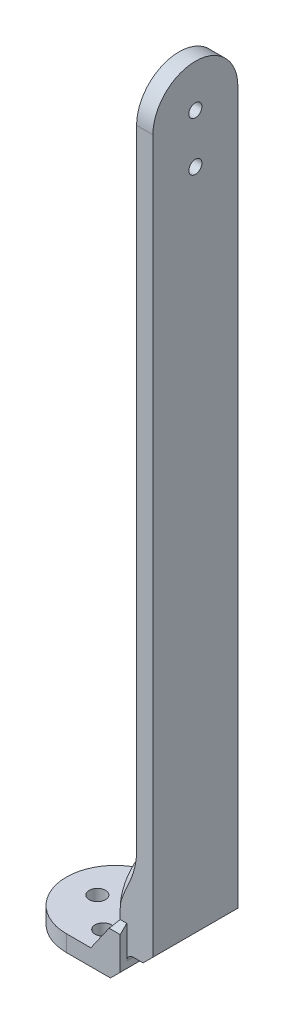
ISO-10303-21;
HEADER;
FILE_DESCRIPTION(('STEP AP214'),'2;1');
FILE_NAME('part.step','',(''),(''),'','','');
FILE_SCHEMA(('AUTOMOTIVE_DESIGN { 1 0 10303 214 1 1 1 1 }'));
ENDSEC;
DATA;
#1=APPLICATION_CONTEXT('core data for automotive mechanical design processes');
#2=APPLICATION_PROTOCOL_DEFINITION('international standard','automotive_design',2000,#1);
#3=PRODUCT_CONTEXT('',#1,'mechanical');
#4=PRODUCT('Part','Part','',(#3));
#5=PRODUCT_RELATED_PRODUCT_CATEGORY('part','',(#4));
#6=PRODUCT_DEFINITION_FORMATION('','',#4);
#7=PRODUCT_DEFINITION_CONTEXT('part definition',#1,'design');
#8=PRODUCT_DEFINITION('design','',#6,#7);
#9=PRODUCT_DEFINITION_SHAPE('','',#8);
#10=(LENGTH_UNIT() NAMED_UNIT(*) SI_UNIT(.MILLI.,.METRE.));
#11=(NAMED_UNIT(*) PLANE_ANGLE_UNIT() SI_UNIT($,.RADIAN.));
#12=(NAMED_UNIT(*) SI_UNIT($,.STERADIAN.) SOLID_ANGLE_UNIT());
#13=UNCERTAINTY_MEASURE_WITH_UNIT(LENGTH_MEASURE(1.E-05),#10,'distance_accuracy_value','');
#14=(GEOMETRIC_REPRESENTATION_CONTEXT(3) GLOBAL_UNCERTAINTY_ASSIGNED_CONTEXT((#13)) GLOBAL_UNIT_ASSIGNED_CONTEXT((#10,
#11,#12)) REPRESENTATION_CONTEXT('',''));
#15=CARTESIAN_POINT('',(0.,0.,0.));
#16=DIRECTION('',(0.,0.,1.));
#17=DIRECTION('',(1.,0.,0.));
#18=AXIS2_PLACEMENT_3D('',#15,#16,#17);
#19=CARTESIAN_POINT('',(-34.25,0.,0.));
#20=DIRECTION('',(1.,0.,0.));
#21=DIRECTION('',(0.,0.,-1.));
#22=AXIS2_PLACEMENT_3D('',#19,#20,#21);
#23=PLANE('',#22);
#24=DIRECTION('',(0.,-1.,0.));
#25=VECTOR('',#24,1.);
#26=CARTESIAN_POINT('',(-34.25,0.,11.));
#27=LINE('',#26,#25);
#28=CARTESIAN_POINT('',(-34.25,-6.,11.));
#29=VERTEX_POINT('',#28);
#30=CARTESIAN_POINT('',(-34.25,-8.,11.));
#31=VERTEX_POINT('',#30);
#32=EDGE_CURVE('E519',#29,#31,#27,.T.);
#33=ORIENTED_EDGE('',*,*,#32,.F.);
#34=DIRECTION('',(0.,0.,-1.));
#35=VECTOR('',#34,1.);
#36=CARTESIAN_POINT('',(-34.25,-6.,-13.));
#37=LINE('',#36,#35);
#38=CARTESIAN_POINT('',(-34.25,-6.,-11.));
#39=VERTEX_POINT('',#38);
#40=EDGE_CURVE('E531',#29,#39,#37,.T.);
#41=ORIENTED_EDGE('',*,*,#40,.T.);
#42=DIRECTION('',(0.,1.,0.));
#43=VECTOR('',#42,1.);
#44=CARTESIAN_POINT('',(-34.25,0.,-11.));
#45=LINE('',#44,#43);
#46=CARTESIAN_POINT('',(-34.25,-8.,-11.));
#47=VERTEX_POINT('',#46);
#48=EDGE_CURVE('E502',#47,#39,#45,.T.);
#49=ORIENTED_EDGE('',*,*,#48,.F.);
#50=DIRECTION('',(0.,0.,1.));
#51=VECTOR('',#50,1.);
#52=CARTESIAN_POINT('',(-34.25,-8.,0.));
#53=LINE('',#52,#51);
#54=EDGE_CURVE('E460',#47,#31,#53,.T.);
#55=ORIENTED_EDGE('',*,*,#54,.T.);
#56=EDGE_LOOP('',(#33,#41,#49,#55));
#57=FACE_BOUND('',#56,.T.);
#58=ADVANCED_FACE('F44',(#57),#23,.F.);
#59=CARTESIAN_POINT('',(-34.25,-6.,-13.));
#60=DIRECTION('',(0.,-1.,0.));
#61=DIRECTION('',(0.,0.,-1.));
#62=AXIS2_PLACEMENT_3D('',#59,#60,#61);
#63=PLANE('',#62);
#64=DIRECTION('',(-1.,0.,0.));
#65=VECTOR('',#64,1.);
#66=CARTESIAN_POINT('',(-34.25,-6.,11.));
#67=LINE('',#66,#65);
#68=CARTESIAN_POINT('',(-30.25,-6.,11.));
#69=VERTEX_POINT('',#68);
#70=EDGE_CURVE('E580',#69,#29,#67,.T.);
#71=ORIENTED_EDGE('',*,*,#70,.F.);
#72=DIRECTION('',(0.,0.,-1.));
#73=VECTOR('',#72,1.);
#74=CARTESIAN_POINT('',(-30.25,-6.,-13.));
#75=LINE('',#74,#73);
#76=CARTESIAN_POINT('',(-30.25,-6.,-11.));
#77=VERTEX_POINT('',#76);
#78=EDGE_CURVE('E535',#69,#77,#75,.T.);
#79=ORIENTED_EDGE('',*,*,#78,.T.);
#80=DIRECTION('',(1.,0.,0.));
#81=VECTOR('',#80,1.);
#82=CARTESIAN_POINT('',(-34.25,-6.,-11.));
#83=LINE('',#82,#81);
#84=EDGE_CURVE('E454',#39,#77,#83,.T.);
#85=ORIENTED_EDGE('',*,*,#84,.F.);
#86=ORIENTED_EDGE('',*,*,#40,.F.);
#87=EDGE_LOOP('',(#71,#79,#85,#86));
#88=FACE_BOUND('',#87,.T.);
#89=ADVANCED_FACE('F343',(#88),#63,.F.);
#90=CARTESIAN_POINT('',(0.,-8.,0.));
#91=DIRECTION('',(0.,-1.,0.));
#92=DIRECTION('',(0.,0.,-1.));
#93=AXIS2_PLACEMENT_3D('',#90,#91,#92);
#94=PLANE('',#93);
#95=CARTESIAN_POINT('',(-40.203234351295,-8.,-8.25));
#96=DIRECTION('',(0.,1.,0.));
#97=DIRECTION('',(0.,0.,1.));
#98=AXIS2_PLACEMENT_3D('',#95,#96,#97);
#99=CIRCLE('',#98,2.5);
#100=CARTESIAN_POINT('',(-40.203234351295,-8.,-5.75));
#101=VERTEX_POINT('',#100);
#102=EDGE_CURVE('E545',#101,#101,#99,.T.);
#103=ORIENTED_EDGE('',*,*,#102,.F.);
#104=EDGE_LOOP('',(#103));
#105=FACE_BOUND('',#104,.T.);
#106=CARTESIAN_POINT('',(-50.25,-8.,0.));
#107=DIRECTION('',(0.,1.,0.));
#108=DIRECTION('',(0.,0.,1.));
#109=AXIS2_PLACEMENT_3D('',#106,#107,#108);
#110=CIRCLE('',#109,2.5);
#111=CARTESIAN_POINT('',(-50.25,-8.,2.5));
#112=VERTEX_POINT('',#111);
#113=EDGE_CURVE('E544',#112,#112,#110,.T.);
#114=ORIENTED_EDGE('',*,*,#113,.F.);
#115=EDGE_LOOP('',(#114));
#116=FACE_BOUND('',#115,.T.);
#117=CARTESIAN_POINT('',(-40.203234351295,-8.,8.25));
#118=DIRECTION('',(0.,1.,0.));
#119=DIRECTION('',(0.,0.,-1.));
#120=AXIS2_PLACEMENT_3D('',#117,#118,#119);
#121=CIRCLE('',#120,2.5);
#122=CARTESIAN_POINT('',(-40.203234351295,-8.,5.75));
#123=VERTEX_POINT('',#122);
#124=EDGE_CURVE('E553',#123,#123,#121,.T.);
#125=ORIENTED_EDGE('',*,*,#124,.F.);
#126=EDGE_LOOP('',(#125));
#127=FACE_BOUND('',#126,.T.);
#128=DIRECTION('',(0.,0.,1.));
#129=VECTOR('',#128,1.);
#130=CARTESIAN_POINT('',(-37.25,-8.,11.));
#131=LINE('',#130,#129);
#132=CARTESIAN_POINT('',(-37.25,-8.,11.));
#133=VERTEX_POINT('',#132);
#134=CARTESIAN_POINT('',(-37.25,-8.,15.));
#135=VERTEX_POINT('',#134);
#136=EDGE_CURVE('E201',#133,#135,#131,.T.);
#137=ORIENTED_EDGE('',*,*,#136,.F.);
#138=DIRECTION('',(-1.,0.,0.));
#139=VECTOR('',#138,1.);
#140=CARTESIAN_POINT('',(-37.25,-8.,11.));
#141=LINE('',#140,#139);
#142=EDGE_CURVE('E575',#31,#133,#141,.T.);
#143=ORIENTED_EDGE('',*,*,#142,.F.);
#144=ORIENTED_EDGE('',*,*,#54,.F.);
#145=DIRECTION('',(-1.,0.,0.));
#146=VECTOR('',#145,1.);
#147=CARTESIAN_POINT('',(-37.25,-8.,-11.));
#148=LINE('',#147,#146);
#149=CARTESIAN_POINT('',(-37.25,-8.,-11.));
#150=VERTEX_POINT('',#149);
#151=EDGE_CURVE('E511',#47,#150,#148,.T.);
#152=ORIENTED_EDGE('',*,*,#151,.T.);
#153=DIRECTION('',(0.,0.,-1.));
#154=VECTOR('',#153,1.);
#155=CARTESIAN_POINT('',(-37.25,-8.,-11.));
#156=LINE('',#155,#154);
#157=CARTESIAN_POINT('',(-37.25,-8.,-15.));
#158=VERTEX_POINT('',#157);
#159=EDGE_CURVE('E504',#150,#158,#156,.T.);
#160=ORIENTED_EDGE('',*,*,#159,.T.);
#161=DIRECTION('',(1.,0.,0.));
#162=VECTOR('',#161,1.);
#163=CARTESIAN_POINT('',(-59.75,-8.,-15.));
#164=LINE('',#163,#162);
#165=CARTESIAN_POINT('',(-44.75,-8.,-15.));
#166=VERTEX_POINT('',#165);
#167=EDGE_CURVE('E227',#166,#158,#164,.T.);
#168=ORIENTED_EDGE('',*,*,#167,.F.);
#169=CARTESIAN_POINT('',(-44.75,-8.,0.));
#170=DIRECTION('',(0.,-1.,0.));
#171=DIRECTION('',(0.,0.,-1.));
#172=AXIS2_PLACEMENT_3D('',#169,#170,#171);
#173=CIRCLE('',#172,15.);
#174=CARTESIAN_POINT('',(-59.75,-8.,0.));
#175=VERTEX_POINT('',#174);
#176=EDGE_CURVE('E485',#166,#175,#173,.F.);
#177=ORIENTED_EDGE('',*,*,#176,.T.);
#178=CARTESIAN_POINT('',(-44.75,-8.,0.));
#179=DIRECTION('',(0.,-1.,0.));
#180=DIRECTION('',(0.,0.,-1.));
#181=AXIS2_PLACEMENT_3D('',#178,#179,#180);
#182=CIRCLE('',#181,15.);
#183=CARTESIAN_POINT('',(-44.75,-8.,15.));
#184=VERTEX_POINT('',#183);
#185=EDGE_CURVE('E225',#175,#184,#182,.F.);
#186=ORIENTED_EDGE('',*,*,#185,.T.);
#187=DIRECTION('',(-1.,0.,0.));
#188=VECTOR('',#187,1.);
#189=CARTESIAN_POINT('',(-59.75,-8.,15.));
#190=LINE('',#189,#188);
#191=EDGE_CURVE('E217',#135,#184,#190,.T.);
#192=ORIENTED_EDGE('',*,*,#191,.F.);
#193=EDGE_LOOP('',(#137,#143,#144,#152,#160,#168,#177,#186,#192));
#194=FACE_BOUND('',#193,.T.);
#195=ADVANCED_FACE('F224',(#105,#116,#127,#194),#94,.F.);
#196=CARTESIAN_POINT('',(-30.25,5.,0.));
#197=DIRECTION('',(-1.,0.,0.));
#198=DIRECTION('',(0.,0.,1.));
#199=AXIS2_PLACEMENT_3D('',#196,#197,#198);
#200=PLANE('',#199);
#201=CARTESIAN_POINT('',(-30.25,5.,0.));
#202=DIRECTION('',(-1.,0.,0.));
#203=DIRECTION('',(0.,0.,1.));
#204=AXIS2_PLACEMENT_3D('',#201,#202,#203);
#205=CIRCLE('',#204,10.);
#206=CARTESIAN_POINT('',(-30.25,5.,10.));
#207=VERTEX_POINT('',#206);
#208=EDGE_CURVE('E280',#207,#207,#205,.T.);
#209=ORIENTED_EDGE('',*,*,#208,.F.);
#210=EDGE_LOOP('',(#209));
#211=FACE_BOUND('',#210,.T.);
#212=DIRECTION('',(0.,1.,0.));
#213=VECTOR('',#212,1.);
#214=CARTESIAN_POINT('',(-30.25,5.,11.));
#215=LINE('',#214,#213);
#216=CARTESIAN_POINT('',(-30.25,2.,11.));
#217=VERTEX_POINT('',#216);
#218=EDGE_CURVE('E213',#69,#217,#215,.T.);
#219=ORIENTED_EDGE('',*,*,#218,.T.);
#220=DIRECTION('',(0.,0.,1.));
#221=VECTOR('',#220,1.);
#222=CARTESIAN_POINT('',(-30.25,2.,11.));
#223=LINE('',#222,#221);
#224=CARTESIAN_POINT('',(-30.25,2.,13.));
#225=VERTEX_POINT('',#224);
#226=EDGE_CURVE('E215',#217,#225,#223,.T.);
#227=ORIENTED_EDGE('',*,*,#226,.T.);
#228=DIRECTION('',(0.,-1.,0.));
#229=VECTOR('',#228,1.);
#230=CARTESIAN_POINT('',(-30.25,228.001,13.));
#231=LINE('',#230,#229);
#232=CARTESIAN_POINT('',(-30.25,5.,13.));
#233=VERTEX_POINT('',#232);
#234=EDGE_CURVE('E226',#233,#225,#231,.T.);
#235=ORIENTED_EDGE('',*,*,#234,.F.);
#236=CARTESIAN_POINT('',(-30.25,5.,0.));
#237=DIRECTION('',(-1.,0.,0.));
#238=DIRECTION('',(0.,0.,1.));
#239=AXIS2_PLACEMENT_3D('',#236,#237,#238);
#240=CIRCLE('',#239,13.);
#241=CARTESIAN_POINT('',(-30.25,5.,-13.));
#242=VERTEX_POINT('',#241);
#243=EDGE_CURVE('E277',#233,#242,#240,.T.);
#244=ORIENTED_EDGE('',*,*,#243,.T.);
#245=DIRECTION('',(0.,-1.,0.));
#246=VECTOR('',#245,1.);
#247=CARTESIAN_POINT('',(-30.25,228.001,-13.));
#248=LINE('',#247,#246);
#249=CARTESIAN_POINT('',(-30.25,2.,-13.));
#250=VERTEX_POINT('',#249);
#251=EDGE_CURVE('E239',#242,#250,#248,.T.);
#252=ORIENTED_EDGE('',*,*,#251,.T.);
#253=DIRECTION('',(0.,0.,-1.));
#254=VECTOR('',#253,1.);
#255=CARTESIAN_POINT('',(-30.25,2.,-11.));
#256=LINE('',#255,#254);
#257=CARTESIAN_POINT('',(-30.25,2.,-11.));
#258=VERTEX_POINT('',#257);
#259=EDGE_CURVE('E494',#258,#250,#256,.T.);
#260=ORIENTED_EDGE('',*,*,#259,.F.);
#261=DIRECTION('',(0.,-1.,0.));
#262=VECTOR('',#261,1.);
#263=CARTESIAN_POINT('',(-30.25,5.,-11.));
#264=LINE('',#263,#262);
#265=EDGE_CURVE('E527',#258,#77,#264,.T.);
#266=ORIENTED_EDGE('',*,*,#265,.T.);
#267=ORIENTED_EDGE('',*,*,#78,.F.);
#268=EDGE_LOOP('',(#219,#227,#235,#244,#252,#260,#266,#267));
#269=FACE_BOUND('',#268,.T.);
#270=ADVANCED_FACE('F312',(#211,#269),#200,.T.);
#271=CARTESIAN_POINT('',(-25.25,215.,13.));
#272=DIRECTION('',(0.,0.,1.));
#273=DIRECTION('',(1.,0.,0.));
#274=AXIS2_PLACEMENT_3D('',#271,#272,#273);
#275=PLANE('',#274);
#276=DIRECTION('',(-1.,0.,0.));
#277=VECTOR('',#276,1.);
#278=CARTESIAN_POINT('',(-25.25,-6.00000000000001,13.));
#279=LINE('',#278,#277);
#280=CARTESIAN_POINT('',(-23.25,-6.00000000000001,13.));
#281=VERTEX_POINT('',#280);
#282=CARTESIAN_POINT('',(-26.25,-6.00000000000001,13.));
#283=VERTEX_POINT('',#282);
#284=EDGE_CURVE('E480',#281,#283,#279,.T.);
#285=ORIENTED_EDGE('',*,*,#284,.F.);
#286=DIRECTION('',(-0.707106781186548,-0.707106781186548,0.));
#287=VECTOR('',#286,1.);
#288=CARTESIAN_POINT('',(86.25,103.5,13.));
#289=LINE('',#288,#287);
#290=CARTESIAN_POINT('',(-20.25,-2.99999999999998,13.));
#291=VERTEX_POINT('',#290);
#292=EDGE_CURVE('E11',#281,#291,#289,.F.);
#293=ORIENTED_EDGE('',*,*,#292,.T.);
#294=DIRECTION('',(0.,-1.,0.));
#295=VECTOR('',#294,1.);
#296=CARTESIAN_POINT('',(-20.25,215.,13.));
#297=LINE('',#296,#295);
#298=CARTESIAN_POINT('',(-20.25,215.,13.));
#299=VERTEX_POINT('',#298);
#300=EDGE_CURVE('E259',#299,#291,#297,.T.);
#301=ORIENTED_EDGE('',*,*,#300,.F.);
#302=DIRECTION('',(1.,0.,0.));
#303=VECTOR('',#302,1.);
#304=CARTESIAN_POINT('',(-25.25,215.,13.));
#305=LINE('',#304,#303);
#306=CARTESIAN_POINT('',(-25.25,215.,13.));
#307=VERTEX_POINT('',#306);
#308=EDGE_CURVE('E275',#307,#299,#305,.T.);
#309=ORIENTED_EDGE('',*,*,#308,.F.);
#310=DIRECTION('',(0.,-1.,0.));
#311=VECTOR('',#310,1.);
#312=CARTESIAN_POINT('',(-25.25,215.,13.));
#313=LINE('',#312,#311);
#314=CARTESIAN_POINT('',(-25.25,22.3253168797559,13.));
#315=VERTEX_POINT('',#314);
#316=EDGE_CURVE('E265',#307,#315,#313,.T.);
#317=ORIENTED_EDGE('',*,*,#316,.T.);
#318=CARTESIAN_POINT('',(-25.25,22.3253168797559,13.));
#319=CARTESIAN_POINT('',(-25.2499980847217,22.0617570442487,13.));
#320=CARTESIAN_POINT('',(-25.2566666611371,21.7982596926096,13.));
#321=CARTESIAN_POINT('',(-25.2826483802802,21.2719699810068,13.));
#322=CARTESIAN_POINT('',(-25.3019573957985,21.0091774190351,13.));
#323=CARTESIAN_POINT('',(-25.3777603615151,20.2229625738944,13.));
#324=CARTESIAN_POINT('',(-25.4521328636717,19.7012046205128,13.));
#325=CARTESIAN_POINT('',(-25.6420718027335,18.6683724712777,13.));
#326=CARTESIAN_POINT('',(-25.7574128892152,18.1572557094616,13.));
#327=CARTESIAN_POINT('',(-25.9566660455814,17.3976979507014,13.));
#328=CARTESIAN_POINT('',(-26.0274510462779,17.1457169327012,13.));
#329=CARTESIAN_POINT('',(-26.1769784992198,16.6441080927741,13.));
#330=CARTESIAN_POINT('',(-26.2557214290855,16.3944804130746,13.));
#331=CARTESIAN_POINT('',(-26.4916544931231,15.6823684677556,13.));
#332=CARTESIAN_POINT('',(-26.6577112352495,15.2228167677706,13.));
#333=CARTESIAN_POINT('',(-27.0090206069845,14.3112607358203,13.));
#334=CARTESIAN_POINT('',(-27.1942721459856,13.8592559767463,13.));
#335=CARTESIAN_POINT('',(-27.4817512102848,13.1854225115711,13.));
#336=CARTESIAN_POINT('',(-27.5791743211592,12.9615146428972,13.));
#337=CARTESIAN_POINT('',(-27.7763037174669,12.5147043395036,13.));
#338=CARTESIAN_POINT('',(-27.8760100185408,12.2918019116841,13.));
#339=CARTESIAN_POINT('',(-28.0767941026496,11.8463246330699,13.));
#340=CARTESIAN_POINT('',(-28.1778732715444,11.6237504108137,13.));
#341=CARTESIAN_POINT('',(-28.3801104057352,11.1786325941297,13.));
#342=CARTESIAN_POINT('',(-28.4812683725014,10.956089000369,13.));
#343=CARTESIAN_POINT('',(-28.6842394025931,10.5060025611996,13.));
#344=CARTESIAN_POINT('',(-28.7860260104624,10.2784477135303,13.));
#345=CARTESIAN_POINT('',(-28.9864025513293,9.82193771836916,13.));
#346=CARTESIAN_POINT('',(-29.08499264882,9.59298264365622,13.));
#347=CARTESIAN_POINT('',(-29.2763955901504,9.13359629544239,13.));
#348=CARTESIAN_POINT('',(-29.3692275882597,8.90317307926783,13.));
#349=CARTESIAN_POINT('',(-29.5467334673255,8.43909492273007,13.));
#350=CARTESIAN_POINT('',(-29.6314052318566,8.20543916185193,13.));
#351=CARTESIAN_POINT('',(-29.7899076681996,7.73186893042751,13.));
#352=CARTESIAN_POINT('',(-29.8636236790118,7.49191552648383,13.));
#353=CARTESIAN_POINT('',(-29.9949869599887,7.00775849547569,13.));
#354=CARTESIAN_POINT('',(-30.052649391667,6.7635591116737,13.));
#355=CARTESIAN_POINT('',(-30.1242254682383,6.39268664135692,13.));
#356=CARTESIAN_POINT('',(-30.1456892746253,6.26745552582972,13.));
#357=CARTESIAN_POINT('',(-30.1829146062684,6.01614822452363,13.));
#358=CARTESIAN_POINT('',(-30.1986765969525,5.89007210857655,13.));
#359=CARTESIAN_POINT('',(-30.224129428176,5.63685235777511,13.));
#360=CARTESIAN_POINT('',(-30.2337985600472,5.50970652329528,13.));
#361=CARTESIAN_POINT('',(-30.2467505281899,5.25504421898492,13.));
#362=CARTESIAN_POINT('',(-30.2500309807929,5.12752762858693,13.));
#363=CARTESIAN_POINT('',(-30.25,5.,13.));
#364=B_SPLINE_CURVE_WITH_KNOTS('',3,(#318,#319,#320,#321,#322,#323,#324,#325,#326,#327,#328,
#329,#330,#331,#332,#333,#334,#335,#336,#337,#338,#339,#340,#341,#342,#343,#344,#345,#346,#347,
#348,#349,#350,#351,#352,#353,#354,#355,#356,#357,#358,#359,#360,#361,#362,#363),.UNSPECIFIED.,
.F.,.F.,(4,2,2,2,2,2,2,2,2,2,2,2,2,2,2,2,2,2,2,2,2,2,4),(0.,0.790489495569374,1.58072101833403,
3.15969446602514,4.73011384383495,5.51520553026805,6.30034436449006,7.7656158006406,
9.23080402879242,9.96334745837972,10.695895907618,11.429248808871,12.1626157371087,
12.9104525346885,13.6582507871594,14.4034109180194,15.1487637952592,15.9014382055543,
16.653399335843,17.0344605713666,17.415490694588,17.7978708522317,18.1803936517354),.UNSPECIFIED.);
#365=EDGE_CURVE('E287',#315,#233,#364,.T.);
#366=ORIENTED_EDGE('',*,*,#365,.T.);
#367=ORIENTED_EDGE('',*,*,#234,.T.);
#368=DIRECTION('',(1.,0.,0.));
#369=VECTOR('',#368,1.);
#370=CARTESIAN_POINT('',(-25.25,2.,13.));
#371=LINE('',#370,#369);
#372=CARTESIAN_POINT('',(-28.25,2.,13.));
#373=VERTEX_POINT('',#372);
#374=EDGE_CURVE('E446',#225,#373,#371,.T.);
#375=ORIENTED_EDGE('',*,*,#374,.T.);
#376=DIRECTION('',(0.,-1.,0.));
#377=VECTOR('',#376,1.);
#378=CARTESIAN_POINT('',(-28.25,215.,13.));
#379=LINE('',#378,#377);
#380=CARTESIAN_POINT('',(-28.25,-8.,13.));
#381=VERTEX_POINT('',#380);
#382=EDGE_CURVE('E513',#373,#381,#379,.T.);
#383=ORIENTED_EDGE('',*,*,#382,.T.);
#384=CARTESIAN_POINT('',(-26.25,-8.,13.));
#385=DIRECTION('',(0.,0.,1.));
#386=DIRECTION('',(1.,0.,0.));
#387=AXIS2_PLACEMENT_3D('',#384,#385,#386);
#388=CIRCLE('',#387,2.);
#389=EDGE_CURVE('E459',#381,#283,#388,.F.);
#390=ORIENTED_EDGE('',*,*,#389,.T.);
#391=EDGE_LOOP('',(#285,#293,#301,#309,#317,#366,#367,#375,#383,#390));
#392=FACE_BOUND('',#391,.T.);
#393=ADVANCED_FACE('F310',(#392),#275,.T.);
#394=CARTESIAN_POINT('',(-59.75,-13.,-15.));
#395=DIRECTION('',(0.,0.,1.));
#396=DIRECTION('',(1.,0.,0.));
#397=AXIS2_PLACEMENT_3D('',#394,#395,#396);
#398=PLANE('',#397);
#399=DIRECTION('',(0.,1.,0.));
#400=VECTOR('',#399,1.);
#401=CARTESIAN_POINT('',(-28.25,-6.,-15.));
#402=LINE('',#401,#400);
#403=CARTESIAN_POINT('',(-28.25,-9.99999999999997,-15.));
#404=VERTEX_POINT('',#403);
#405=CARTESIAN_POINT('',(-28.25,0.,-15.));
#406=VERTEX_POINT('',#405);
#407=EDGE_CURVE('E515',#404,#406,#402,.T.);
#408=ORIENTED_EDGE('',*,*,#407,.F.);
#409=DIRECTION('',(-0.707106781186546,-0.707106781186549,0.));
#410=VECTOR('',#409,1.);
#411=CARTESIAN_POINT('',(-28.25,-9.99999999999997,-15.));
#412=LINE('',#411,#410);
#413=CARTESIAN_POINT('',(-31.25,-13.,-15.));
#414=VERTEX_POINT('',#413);
#415=EDGE_CURVE('E431',#404,#414,#412,.T.);
#416=ORIENTED_EDGE('',*,*,#415,.T.);
#417=DIRECTION('',(1.,0.,0.));
#418=VECTOR('',#417,1.);
#419=CARTESIAN_POINT('',(-59.75,-13.,-15.));
#420=LINE('',#419,#418);
#421=CARTESIAN_POINT('',(-44.75,-13.,-15.));
#422=VERTEX_POINT('',#421);
#423=EDGE_CURVE('E240',#422,#414,#420,.T.);
#424=ORIENTED_EDGE('',*,*,#423,.F.);
#425=DIRECTION('',(0.,1.,0.));
#426=VECTOR('',#425,1.);
#427=CARTESIAN_POINT('',(-44.75,-13.,-15.));
#428=LINE('',#427,#426);
#429=EDGE_CURVE('E475',#422,#166,#428,.T.);
#430=ORIENTED_EDGE('',*,*,#429,.T.);
#431=ORIENTED_EDGE('',*,*,#167,.T.);
#432=DIRECTION('',(0.573462344363328,0.81923192051904,0.));
#433=VECTOR('',#432,1.);
#434=CARTESIAN_POINT('',(-30.25,2.,-15.));
#435=LINE('',#434,#433);
#436=CARTESIAN_POINT('',(-31.65,0.,-15.));
#437=VERTEX_POINT('',#436);
#438=EDGE_CURVE('E514',#158,#437,#435,.T.);
#439=ORIENTED_EDGE('',*,*,#438,.T.);
#440=DIRECTION('',(1.,0.,0.));
#441=VECTOR('',#440,1.);
#442=CARTESIAN_POINT('',(-28.25,0.,-15.));
#443=LINE('',#442,#441);
#444=EDGE_CURVE('E447',#437,#406,#443,.T.);
#445=ORIENTED_EDGE('',*,*,#444,.T.);
#446=EDGE_LOOP('',(#408,#416,#424,#430,#431,#439,#445));
#447=FACE_BOUND('',#446,.T.);
#448=ADVANCED_FACE('F315',(#447),#398,.F.);
#449=CARTESIAN_POINT('',(-30.25,5.,0.));
#450=DIRECTION('',(1.,0.,0.));
#451=DIRECTION('',(0.,0.,-1.));
#452=AXIS2_PLACEMENT_3D('',#449,#450,#451);
#453=CYLINDRICAL_SURFACE('',#452,10.);
#454=ORIENTED_EDGE('',*,*,#208,.T.);
#455=EDGE_LOOP('',(#454));
#456=FACE_BOUND('',#455,.T.);
#457=CARTESIAN_POINT('',(-25.25,5.,0.));
#458=DIRECTION('',(1.,0.,0.));
#459=DIRECTION('',(0.,0.,-1.));
#460=AXIS2_PLACEMENT_3D('',#457,#458,#459);
#461=CIRCLE('',#460,10.);
#462=CARTESIAN_POINT('',(-25.25,5.,-10.));
#463=VERTEX_POINT('',#462);
#464=EDGE_CURVE('E274',#463,#463,#461,.T.);
#465=ORIENTED_EDGE('',*,*,#464,.T.);
#466=EDGE_LOOP('',(#465));
#467=FACE_BOUND('',#466,.T.);
#468=ADVANCED_FACE('F322',(#456,#467),#453,.F.);
#469=CARTESIAN_POINT('',(-20.25,5.,0.));
#470=DIRECTION('',(-1.,0.,0.));
#471=DIRECTION('',(0.,0.,1.));
#472=AXIS2_PLACEMENT_3D('',#469,#470,#471);
#473=PLANE('',#472);
#474=ORIENTED_EDGE('',*,*,#300,.T.);
#475=DIRECTION('',(0.,0.,-1.));
#476=VECTOR('',#475,1.);
#477=CARTESIAN_POINT('',(-20.25,-2.99999999999997,0.));
#478=LINE('',#477,#476);
#479=CARTESIAN_POINT('',(-20.25,-2.99999999999998,-13.));
#480=VERTEX_POINT('',#479);
#481=EDGE_CURVE('E423',#291,#480,#478,.T.);
#482=ORIENTED_EDGE('',*,*,#481,.T.);
#483=DIRECTION('',(0.,1.,0.));
#484=VECTOR('',#483,1.);
#485=CARTESIAN_POINT('',(-20.25,215.,-13.));
#486=LINE('',#485,#484);
#487=CARTESIAN_POINT('',(-20.25,215.,-13.));
#488=VERTEX_POINT('',#487);
#489=EDGE_CURVE('E254',#480,#488,#486,.T.);
#490=ORIENTED_EDGE('',*,*,#489,.T.);
#491=CARTESIAN_POINT('',(-20.25,215.,0.));
#492=DIRECTION('',(1.,0.,0.));
#493=DIRECTION('',(0.,0.,-1.));
#494=AXIS2_PLACEMENT_3D('',#491,#492,#493);
#495=CIRCLE('',#494,13.);
#496=EDGE_CURVE('E267',#488,#299,#495,.T.);
#497=ORIENTED_EDGE('',*,*,#496,.T.);
#498=EDGE_LOOP('',(#474,#482,#490,#497));
#499=FACE_BOUND('',#498,.T.);
#500=CARTESIAN_POINT('',(-20.25,200.,0.));
#501=DIRECTION('',(1.,0.,0.));
#502=DIRECTION('',(0.,0.,-1.));
#503=AXIS2_PLACEMENT_3D('',#500,#501,#502);
#504=CIRCLE('',#503,2.);
#505=CARTESIAN_POINT('',(-20.25,200.,-2.));
#506=VERTEX_POINT('',#505);
#507=EDGE_CURVE('E250',#506,#506,#504,.T.);
#508=ORIENTED_EDGE('',*,*,#507,.F.);
#509=EDGE_LOOP('',(#508));
#510=FACE_BOUND('',#509,.T.);
#511=CARTESIAN_POINT('',(-20.25,215.,0.));
#512=DIRECTION('',(1.,0.,0.));
#513=DIRECTION('',(0.,0.,-1.));
#514=AXIS2_PLACEMENT_3D('',#511,#512,#513);
#515=CIRCLE('',#514,2.);
#516=CARTESIAN_POINT('',(-20.25,215.,-2.));
#517=VERTEX_POINT('',#516);
#518=EDGE_CURVE('E243',#517,#517,#515,.T.);
#519=ORIENTED_EDGE('',*,*,#518,.F.);
#520=EDGE_LOOP('',(#519));
#521=FACE_BOUND('',#520,.T.);
#522=ADVANCED_FACE('F327',(#499,#510,#521),#473,.F.);
#523=CARTESIAN_POINT('',(-25.25,5.,0.));
#524=DIRECTION('',(1.,0.,0.));
#525=DIRECTION('',(0.,0.,-1.));
#526=AXIS2_PLACEMENT_3D('',#523,#524,#525);
#527=PLANE('',#526);
#528=ORIENTED_EDGE('',*,*,#464,.F.);
#529=EDGE_LOOP('',(#528));
#530=FACE_BOUND('',#529,.T.);
#531=ADVANCED_FACE('F318',(#530),#527,.F.);
#532=CARTESIAN_POINT('',(-25.25,215.,0.));
#533=DIRECTION('',(1.,0.,0.));
#534=DIRECTION('',(0.,0.,-1.));
#535=AXIS2_PLACEMENT_3D('',#532,#533,#534);
#536=CYLINDRICAL_SURFACE('',#535,13.);
#537=ORIENTED_EDGE('',*,*,#496,.F.);
#538=DIRECTION('',(1.,0.,0.));
#539=VECTOR('',#538,1.);
#540=CARTESIAN_POINT('',(-25.25,215.,-13.));
#541=LINE('',#540,#539);
#542=CARTESIAN_POINT('',(-25.25,215.,-13.));
#543=VERTEX_POINT('',#542);
#544=EDGE_CURVE('E264',#543,#488,#541,.T.);
#545=ORIENTED_EDGE('',*,*,#544,.F.);
#546=CARTESIAN_POINT('',(-25.25,215.,0.));
#547=DIRECTION('',(1.,0.,0.));
#548=DIRECTION('',(0.,0.,-1.));
#549=AXIS2_PLACEMENT_3D('',#546,#547,#548);
#550=CIRCLE('',#549,13.);
#551=EDGE_CURVE('E256',#543,#307,#550,.T.);
#552=ORIENTED_EDGE('',*,*,#551,.T.);
#553=ORIENTED_EDGE('',*,*,#308,.T.);
#554=EDGE_LOOP('',(#537,#545,#552,#553));
#555=FACE_BOUND('',#554,.T.);
#556=ADVANCED_FACE('F320',(#555),#536,.T.);
#557=CARTESIAN_POINT('',(-25.25,215.,-13.));
#558=DIRECTION('',(0.,0.,-1.));
#559=DIRECTION('',(0.,1.,0.));
#560=AXIS2_PLACEMENT_3D('',#557,#558,#559);
#561=PLANE('',#560);
#562=ORIENTED_EDGE('',*,*,#489,.F.);
#563=DIRECTION('',(0.707106781186548,0.707106781186548,0.));
#564=VECTOR('',#563,1.);
#565=CARTESIAN_POINT('',(86.25,103.5,-13.));
#566=LINE('',#565,#564);
#567=CARTESIAN_POINT('',(-23.25,-6.00000000000001,-13.));
#568=VERTEX_POINT('',#567);
#569=EDGE_CURVE('E67',#480,#568,#566,.F.);
#570=ORIENTED_EDGE('',*,*,#569,.T.);
#571=DIRECTION('',(1.,0.,0.));
#572=VECTOR('',#571,1.);
#573=CARTESIAN_POINT('',(-25.25,-6.00000000000001,-13.));
#574=LINE('',#573,#572);
#575=CARTESIAN_POINT('',(-26.25,-6.00000000000001,-13.));
#576=VERTEX_POINT('',#575);
#577=EDGE_CURVE('E468',#576,#568,#574,.T.);
#578=ORIENTED_EDGE('',*,*,#577,.F.);
#579=CARTESIAN_POINT('',(-26.25,-8.,-13.));
#580=DIRECTION('',(0.,0.,-1.));
#581=DIRECTION('',(0.,1.,0.));
#582=AXIS2_PLACEMENT_3D('',#579,#580,#581);
#583=CIRCLE('',#582,2.);
#584=CARTESIAN_POINT('',(-28.25,-8.,-13.));
#585=VERTEX_POINT('',#584);
#586=EDGE_CURVE('E464',#576,#585,#583,.F.);
#587=ORIENTED_EDGE('',*,*,#586,.T.);
#588=DIRECTION('',(0.,-1.,0.));
#589=VECTOR('',#588,1.);
#590=CARTESIAN_POINT('',(-28.25,215.,-13.));
#591=LINE('',#590,#589);
#592=CARTESIAN_POINT('',(-28.25,2.,-13.));
#593=VERTEX_POINT('',#592);
#594=EDGE_CURVE('E528',#593,#585,#591,.T.);
#595=ORIENTED_EDGE('',*,*,#594,.F.);
#596=DIRECTION('',(1.,0.,0.));
#597=VECTOR('',#596,1.);
#598=CARTESIAN_POINT('',(-25.25,2.,-13.));
#599=LINE('',#598,#597);
#600=EDGE_CURVE('E453',#250,#593,#599,.T.);
#601=ORIENTED_EDGE('',*,*,#600,.F.);
#602=ORIENTED_EDGE('',*,*,#251,.F.);
#603=CARTESIAN_POINT('',(-30.25,5.,-13.));
#604=CARTESIAN_POINT('',(-30.2500056019238,5.08965435095389,-13.));
#605=CARTESIAN_POINT('',(-30.248392868406,5.17930065969381,-13.));
#606=CARTESIAN_POINT('',(-30.2419815367673,5.35847074597676,-13.));
#607=CARTESIAN_POINT('',(-30.2371832514784,5.44799453468671,-13.));
#608=CARTESIAN_POINT('',(-30.2181030615552,5.71600615346502,-13.));
#609=CARTESIAN_POINT('',(-30.1991355515932,5.89417812995479,-13.));
#610=CARTESIAN_POINT('',(-30.1499357450873,6.24703368869215,-13.));
#611=CARTESIAN_POINT('',(-30.1198223206804,6.42173428523119,-13.));
#612=CARTESIAN_POINT('',(-30.0496666509659,6.76916307890242,-13.));
#613=CARTESIAN_POINT('',(-30.0096213946837,6.94189066124571,-13.));
#614=CARTESIAN_POINT('',(-29.9211467460372,7.2851000656238,-13.));
#615=CARTESIAN_POINT('',(-29.8727200234906,7.45558258424519,-13.));
#616=CARTESIAN_POINT('',(-29.7689854519534,7.79441174070556,-13.));
#617=CARTESIAN_POINT('',(-29.7136779413492,7.96275848313031,-13.));
#618=CARTESIAN_POINT('',(-29.5973490771302,8.29816517676183,-13.));
#619=CARTESIAN_POINT('',(-29.5363068778683,8.46521784032122,-13.));
#620=CARTESIAN_POINT('',(-29.4099237956345,8.79766977095107,-13.));
#621=CARTESIAN_POINT('',(-29.3445830947847,8.96306910772934,-13.));
#622=CARTESIAN_POINT('',(-29.1697045168308,9.39337581793867,-13.));
#623=CARTESIAN_POINT('',(-29.0575914549518,9.65723128559471,-13.));
#624=CARTESIAN_POINT('',(-28.8286402501217,10.1828925816907,-13.));
#625=CARTESIAN_POINT('',(-28.7118015170458,10.444698149244,-13.));
#626=CARTESIAN_POINT('',(-28.4761806977696,10.9675380701129,-13.));
#627=CARTESIAN_POINT('',(-28.3573979501502,11.2285721237081,-13.));
#628=CARTESIAN_POINT('',(-28.1201859828152,11.7507852351949,-13.));
#629=CARTESIAN_POINT('',(-28.0017567453596,12.0119642850028,-13.));
#630=CARTESIAN_POINT('',(-27.7676380168079,12.5341026728793,-13.));
#631=CARTESIAN_POINT('',(-27.6519383837575,12.7950574351166,-13.));
#632=CARTESIAN_POINT('',(-27.4242711911687,13.3185996106046,-13.));
#633=CARTESIAN_POINT('',(-27.3123036629783,13.581187037547,-13.));
#634=CARTESIAN_POINT('',(-27.0934705834414,14.1085045558769,-13.));
#635=CARTESIAN_POINT('',(-26.9866052327695,14.3732347310631,-13.));
#636=CARTESIAN_POINT('',(-26.779230740569,14.905170873181,-13.));
#637=CARTESIAN_POINT('',(-26.6787216176203,15.1723768473472,-13.));
#638=CARTESIAN_POINT('',(-26.385510444732,15.9863594340849,-13.));
#639=CARTESIAN_POINT('',(-26.2045454398927,16.5374601927441,-13.));
#640=CARTESIAN_POINT('',(-25.8828527453864,17.6511146702757,-13.));
#641=CARTESIAN_POINT('',(-25.7420951678271,18.2136595472762,-13.));
#642=CARTESIAN_POINT('',(-25.5659287825132,19.0720854299519,-13.));
#643=CARTESIAN_POINT('',(-25.5126069296566,19.3643385340628,-13.));
#644=CARTESIAN_POINT('',(-25.4198224018172,19.9510292891363,-13.));
#645=CARTESIAN_POINT('',(-25.3803581447815,20.2454666868074,-13.));
#646=CARTESIAN_POINT('',(-25.3162545130286,20.8369470451726,-13.));
#647=CARTESIAN_POINT('',(-25.2916641130922,21.133995381061,-13.));
#648=CARTESIAN_POINT('',(-25.2585284866831,21.7291144349595,-13.));
#649=CARTESIAN_POINT('',(-25.2499906759279,22.027185561795,-13.));
#650=CARTESIAN_POINT('',(-25.25,22.3253168797559,-13.));
#651=B_SPLINE_CURVE_WITH_KNOTS('',3,(#603,#604,#605,#606,#607,#608,#609,#610,#611,#612,#613,
#614,#615,#616,#617,#618,#619,#620,#621,#622,#623,#624,#625,#626,#627,#628,#629,#630,#631,#632,
#633,#634,#635,#636,#637,#638,#639,#640,#641,#642,#643,#644,#645,#646,#647,#648,#649,#650),
.UNSPECIFIED.,.F.,.F.,(4,2,2,2,2,2,2,2,2,2,2,2,2,2,2,2,2,2,2,2,2,2,2,4),(0.,0.268933172083739,
0.537839937907302,1.0749234570971,1.60643665576927,2.13811118752675,2.66961667125123,
3.2010960267002,3.73458814556346,4.26805767556551,5.1280183053451,5.98808665747486,
6.84845398166465,7.70877737913339,8.56511973859628,9.42146928915171,10.2778524932503,
11.1342382005472,12.8731903009987,14.6108463803658,15.5018008230113,16.392653516726,
17.2864237537457,18.180606779037),.UNSPECIFIED.);
#652=CARTESIAN_POINT('',(-25.25,22.3253168797559,-13.));
#653=VERTEX_POINT('',#652);
#654=EDGE_CURVE('E298',#242,#653,#651,.T.);
#655=ORIENTED_EDGE('',*,*,#654,.T.);
#656=DIRECTION('',(0.,1.,0.));
#657=VECTOR('',#656,1.);
#658=CARTESIAN_POINT('',(-25.25,215.,-13.));
#659=LINE('',#658,#657);
#660=EDGE_CURVE('E258',#653,#543,#659,.T.);
#661=ORIENTED_EDGE('',*,*,#660,.T.);
#662=ORIENTED_EDGE('',*,*,#544,.T.);
#663=EDGE_LOOP('',(#562,#570,#578,#587,#595,#601,#602,#655,#661,#662));
#664=FACE_BOUND('',#663,.T.);
#665=ADVANCED_FACE('F316',(#664),#561,.T.);
#666=CARTESIAN_POINT('',(-25.25,215.,0.));
#667=DIRECTION('',(1.,0.,0.));
#668=DIRECTION('',(0.,0.,-1.));
#669=AXIS2_PLACEMENT_3D('',#666,#667,#668);
#670=CIRCLE('',#669,2.);
#671=CARTESIAN_POINT('',(-25.25,215.,-2.));
#672=VERTEX_POINT('',#671);
#673=EDGE_CURVE('E242',#672,#672,#670,.T.);
#674=ORIENTED_EDGE('',*,*,#673,.T.);
#675=EDGE_LOOP('',(#674));
#676=FACE_BOUND('',#675,.T.);
#677=CARTESIAN_POINT('',(-25.25,200.,0.));
#678=DIRECTION('',(1.,0.,0.));
#679=DIRECTION('',(0.,0.,-1.));
#680=AXIS2_PLACEMENT_3D('',#677,#678,#679);
#681=CIRCLE('',#680,2.);
#682=CARTESIAN_POINT('',(-25.25,200.,-2.));
#683=VERTEX_POINT('',#682);
#684=EDGE_CURVE('E249',#683,#683,#681,.T.);
#685=ORIENTED_EDGE('',*,*,#684,.T.);
#686=EDGE_LOOP('',(#685));
#687=FACE_BOUND('',#686,.T.);
#688=ORIENTED_EDGE('',*,*,#660,.F.);
#689=CARTESIAN_POINT('',(-25.25,5.,0.));
#690=DIRECTION('',(1.,0.,0.));
#691=DIRECTION('',(0.,0.,-1.));
#692=AXIS2_PLACEMENT_3D('',#689,#690,#691);
#693=CIRCLE('',#692,21.6602540378444);
#694=EDGE_CURVE('E285',#653,#315,#693,.T.);
#695=ORIENTED_EDGE('',*,*,#694,.T.);
#696=ORIENTED_EDGE('',*,*,#316,.F.);
#697=ORIENTED_EDGE('',*,*,#551,.F.);
#698=EDGE_LOOP('',(#688,#695,#696,#697));
#699=FACE_BOUND('',#698,.T.);
#700=ADVANCED_FACE('F314',(#676,#687,#699),#527,.F.);
#701=CARTESIAN_POINT('',(-25.25,200.,0.));
#702=DIRECTION('',(1.,0.,0.));
#703=DIRECTION('',(0.,0.,-1.));
#704=AXIS2_PLACEMENT_3D('',#701,#702,#703);
#705=CYLINDRICAL_SURFACE('',#704,2.);
#706=ORIENTED_EDGE('',*,*,#684,.F.);
#707=EDGE_LOOP('',(#706));
#708=FACE_BOUND('',#707,.T.);
#709=ORIENTED_EDGE('',*,*,#507,.T.);
#710=EDGE_LOOP('',(#709));
#711=FACE_BOUND('',#710,.T.);
#712=ADVANCED_FACE('F387',(#708,#711),#705,.F.);
#713=CARTESIAN_POINT('',(-25.25,215.,0.));
#714=DIRECTION('',(1.,0.,0.));
#715=DIRECTION('',(0.,0.,-1.));
#716=AXIS2_PLACEMENT_3D('',#713,#714,#715);
#717=CYLINDRICAL_SURFACE('',#716,2.);
#718=ORIENTED_EDGE('',*,*,#673,.F.);
#719=EDGE_LOOP('',(#718));
#720=FACE_BOUND('',#719,.T.);
#721=ORIENTED_EDGE('',*,*,#518,.T.);
#722=EDGE_LOOP('',(#721));
#723=FACE_BOUND('',#722,.T.);
#724=ADVANCED_FACE('F386',(#720,#723),#717,.F.);
#725=CARTESIAN_POINT('',(-35.25,5.,0.));
#726=DIRECTION('',(1.,0.,0.));
#727=DIRECTION('',(0.,0.,-1.));
#728=AXIS2_PLACEMENT_3D('',#725,#726,#727);
#729=TOROIDAL_SURFACE('',#728,21.6602540378444,10.);
#730=ORIENTED_EDGE('',*,*,#654,.F.);
#731=ORIENTED_EDGE('',*,*,#243,.F.);
#732=ORIENTED_EDGE('',*,*,#365,.F.);
#733=ORIENTED_EDGE('',*,*,#694,.F.);
#734=EDGE_LOOP('',(#730,#731,#732,#733));
#735=FACE_BOUND('',#734,.T.);
#736=ADVANCED_FACE('F303',(#735),#729,.F.);
#737=CARTESIAN_POINT('',(-59.75,-13.,15.));
#738=DIRECTION('',(0.,0.,-1.));
#739=DIRECTION('',(-1.,0.,0.));
#740=AXIS2_PLACEMENT_3D('',#737,#738,#739);
#741=PLANE('',#740);
#742=DIRECTION('',(-1.,0.,0.));
#743=VECTOR('',#742,1.);
#744=CARTESIAN_POINT('',(-59.75,-13.,15.));
#745=LINE('',#744,#743);
#746=CARTESIAN_POINT('',(-31.25,-13.,15.));
#747=VERTEX_POINT('',#746);
#748=CARTESIAN_POINT('',(-44.75,-13.,15.));
#749=VERTEX_POINT('',#748);
#750=EDGE_CURVE('E233',#747,#749,#745,.T.);
#751=ORIENTED_EDGE('',*,*,#750,.F.);
#752=DIRECTION('',(0.707106781186546,0.707106781186549,0.));
#753=VECTOR('',#752,1.);
#754=CARTESIAN_POINT('',(-28.25,-9.99999999999997,15.));
#755=LINE('',#754,#753);
#756=CARTESIAN_POINT('',(-28.25,-9.99999999999997,15.));
#757=VERTEX_POINT('',#756);
#758=EDGE_CURVE('E425',#747,#757,#755,.T.);
#759=ORIENTED_EDGE('',*,*,#758,.T.);
#760=DIRECTION('',(0.,1.,0.));
#761=VECTOR('',#760,1.);
#762=CARTESIAN_POINT('',(-28.25,-6.,15.));
#763=LINE('',#762,#761);
#764=CARTESIAN_POINT('',(-28.25,0.,15.));
#765=VERTEX_POINT('',#764);
#766=EDGE_CURVE('E538',#757,#765,#763,.T.);
#767=ORIENTED_EDGE('',*,*,#766,.T.);
#768=DIRECTION('',(-1.,0.,0.));
#769=VECTOR('',#768,1.);
#770=CARTESIAN_POINT('',(-59.75,0.,15.));
#771=LINE('',#770,#769);
#772=CARTESIAN_POINT('',(-31.65,0.,15.));
#773=VERTEX_POINT('',#772);
#774=EDGE_CURVE('E221',#765,#773,#771,.T.);
#775=ORIENTED_EDGE('',*,*,#774,.T.);
#776=DIRECTION('',(0.573462344363328,0.81923192051904,0.));
#777=VECTOR('',#776,1.);
#778=CARTESIAN_POINT('',(-30.25,2.,15.));
#779=LINE('',#778,#777);
#780=EDGE_CURVE('E203',#135,#773,#779,.T.);
#781=ORIENTED_EDGE('',*,*,#780,.F.);
#782=ORIENTED_EDGE('',*,*,#191,.T.);
#783=DIRECTION('',(0.,1.,0.));
#784=VECTOR('',#783,1.);
#785=CARTESIAN_POINT('',(-44.75,-13.,15.));
#786=LINE('',#785,#784);
#787=EDGE_CURVE('E484',#184,#749,#786,.F.);
#788=ORIENTED_EDGE('',*,*,#787,.T.);
#789=EDGE_LOOP('',(#751,#759,#767,#775,#781,#782,#788));
#790=FACE_BOUND('',#789,.T.);
#791=ADVANCED_FACE('F216',(#790),#741,.F.);
#792=CARTESIAN_POINT('',(0.,-13.,0.));
#793=DIRECTION('',(0.,-1.,0.));
#794=DIRECTION('',(0.,0.,-1.));
#795=AXIS2_PLACEMENT_3D('',#792,#793,#794);
#796=PLANE('',#795);
#797=ORIENTED_EDGE('',*,*,#423,.T.);
#798=DIRECTION('',(0.,0.,1.));
#799=VECTOR('',#798,1.);
#800=CARTESIAN_POINT('',(-31.25,-13.,15.));
#801=LINE('',#800,#799);
#802=EDGE_CURVE('E430',#414,#747,#801,.T.);
#803=ORIENTED_EDGE('',*,*,#802,.T.);
#804=ORIENTED_EDGE('',*,*,#750,.T.);
#805=CARTESIAN_POINT('',(-44.75,-13.,0.));
#806=DIRECTION('',(0.,-1.,0.));
#807=DIRECTION('',(0.,0.,-1.));
#808=AXIS2_PLACEMENT_3D('',#805,#806,#807);
#809=CIRCLE('',#808,15.);
#810=CARTESIAN_POINT('',(-59.75,-13.,0.));
#811=VERTEX_POINT('',#810);
#812=EDGE_CURVE('E478',#749,#811,#809,.T.);
#813=ORIENTED_EDGE('',*,*,#812,.T.);
#814=CARTESIAN_POINT('',(-44.75,-13.,0.));
#815=DIRECTION('',(0.,-1.,0.));
#816=DIRECTION('',(0.,0.,-1.));
#817=AXIS2_PLACEMENT_3D('',#814,#815,#816);
#818=CIRCLE('',#817,15.);
#819=EDGE_CURVE('E481',#811,#422,#818,.T.);
#820=ORIENTED_EDGE('',*,*,#819,.T.);
#821=EDGE_LOOP('',(#797,#803,#804,#813,#820));
#822=FACE_BOUND('',#821,.T.);
#823=CARTESIAN_POINT('',(-40.203234351295,-13.,-8.25));
#824=DIRECTION('',(0.,1.,0.));
#825=DIRECTION('',(0.,0.,1.));
#826=AXIS2_PLACEMENT_3D('',#823,#824,#825);
#827=CIRCLE('',#826,2.5);
#828=CARTESIAN_POINT('',(-40.203234351295,-13.,-5.75));
#829=VERTEX_POINT('',#828);
#830=EDGE_CURVE('E234',#829,#829,#827,.T.);
#831=ORIENTED_EDGE('',*,*,#830,.T.);
#832=EDGE_LOOP('',(#831));
#833=FACE_BOUND('',#832,.T.);
#834=CARTESIAN_POINT('',(-50.25,-13.,0.));
#835=DIRECTION('',(0.,1.,0.));
#836=DIRECTION('',(0.,0.,1.));
#837=AXIS2_PLACEMENT_3D('',#834,#835,#836);
#838=CIRCLE('',#837,2.5);
#839=CARTESIAN_POINT('',(-50.25,-13.,2.5));
#840=VERTEX_POINT('',#839);
#841=EDGE_CURVE('E549',#840,#840,#838,.T.);
#842=ORIENTED_EDGE('',*,*,#841,.T.);
#843=EDGE_LOOP('',(#842));
#844=FACE_BOUND('',#843,.T.);
#845=CARTESIAN_POINT('',(-40.203234351295,-13.,8.25));
#846=DIRECTION('',(0.,1.,0.));
#847=DIRECTION('',(0.,0.,-1.));
#848=AXIS2_PLACEMENT_3D('',#845,#846,#847);
#849=CIRCLE('',#848,2.5);
#850=CARTESIAN_POINT('',(-40.203234351295,-13.,5.75));
#851=VERTEX_POINT('',#850);
#852=EDGE_CURVE('E476',#851,#851,#849,.T.);
#853=ORIENTED_EDGE('',*,*,#852,.T.);
#854=EDGE_LOOP('',(#853));
#855=FACE_BOUND('',#854,.T.);
#856=ADVANCED_FACE('F376',(#822,#833,#844,#855),#796,.T.);
#857=CARTESIAN_POINT('',(-40.203234351295,-13.,8.25));
#858=DIRECTION('',(0.,1.,0.));
#859=DIRECTION('',(0.,0.,1.));
#860=AXIS2_PLACEMENT_3D('',#857,#858,#859);
#861=CYLINDRICAL_SURFACE('',#860,2.5);
#862=ORIENTED_EDGE('',*,*,#852,.F.);
#863=EDGE_LOOP('',(#862));
#864=FACE_BOUND('',#863,.T.);
#865=ORIENTED_EDGE('',*,*,#124,.T.);
#866=EDGE_LOOP('',(#865));
#867=FACE_BOUND('',#866,.T.);
#868=ADVANCED_FACE('F375',(#864,#867),#861,.F.);
#869=CARTESIAN_POINT('',(-50.25,-13.,0.));
#870=DIRECTION('',(0.,1.,0.));
#871=DIRECTION('',(0.,0.,1.));
#872=AXIS2_PLACEMENT_3D('',#869,#870,#871);
#873=CYLINDRICAL_SURFACE('',#872,2.5);
#874=ORIENTED_EDGE('',*,*,#841,.F.);
#875=EDGE_LOOP('',(#874));
#876=FACE_BOUND('',#875,.T.);
#877=ORIENTED_EDGE('',*,*,#113,.T.);
#878=EDGE_LOOP('',(#877));
#879=FACE_BOUND('',#878,.T.);
#880=ADVANCED_FACE('F368',(#876,#879),#873,.F.);
#881=CARTESIAN_POINT('',(-40.203234351295,-13.,-8.25));
#882=DIRECTION('',(0.,1.,0.));
#883=DIRECTION('',(0.,0.,1.));
#884=AXIS2_PLACEMENT_3D('',#881,#882,#883);
#885=CYLINDRICAL_SURFACE('',#884,2.5);
#886=ORIENTED_EDGE('',*,*,#830,.F.);
#887=EDGE_LOOP('',(#886));
#888=FACE_BOUND('',#887,.T.);
#889=ORIENTED_EDGE('',*,*,#102,.T.);
#890=EDGE_LOOP('',(#889));
#891=FACE_BOUND('',#890,.T.);
#892=ADVANCED_FACE('F364',(#888,#891),#885,.F.);
#893=CARTESIAN_POINT('',(-44.75,-13.,0.));
#894=DIRECTION('',(0.,1.,0.));
#895=DIRECTION('',(0.,0.,1.));
#896=AXIS2_PLACEMENT_3D('',#893,#894,#895);
#897=CYLINDRICAL_SURFACE('',#896,15.);
#898=ORIENTED_EDGE('',*,*,#429,.F.);
#899=ORIENTED_EDGE('',*,*,#819,.F.);
#900=DIRECTION('',(0.,1.,0.));
#901=VECTOR('',#900,1.);
#902=CARTESIAN_POINT('',(-59.75,-13.,0.));
#903=LINE('',#902,#901);
#904=EDGE_CURVE('E471',#175,#811,#903,.F.);
#905=ORIENTED_EDGE('',*,*,#904,.F.);
#906=ORIENTED_EDGE('',*,*,#176,.F.);
#907=EDGE_LOOP('',(#898,#899,#905,#906));
#908=FACE_BOUND('',#907,.T.);
#909=ADVANCED_FACE('F370',(#908),#897,.T.);
#910=CARTESIAN_POINT('',(-44.75,-13.,0.));
#911=DIRECTION('',(0.,1.,0.));
#912=DIRECTION('',(0.,0.,1.));
#913=AXIS2_PLACEMENT_3D('',#910,#911,#912);
#914=CYLINDRICAL_SURFACE('',#913,15.);
#915=ORIENTED_EDGE('',*,*,#812,.F.);
#916=ORIENTED_EDGE('',*,*,#787,.F.);
#917=ORIENTED_EDGE('',*,*,#185,.F.);
#918=ORIENTED_EDGE('',*,*,#904,.T.);
#919=EDGE_LOOP('',(#915,#916,#917,#918));
#920=FACE_BOUND('',#919,.T.);
#921=ADVANCED_FACE('F360',(#920),#914,.T.);
#922=CARTESIAN_POINT('',(-28.25,-6.,15.));
#923=DIRECTION('',(0.,1.,0.));
#924=DIRECTION('',(-1.,0.,0.));
#925=AXIS2_PLACEMENT_3D('',#922,#923,#924);
#926=PLANE('',#925);
#927=ORIENTED_EDGE('',*,*,#577,.T.);
#928=DIRECTION('',(0.,0.,1.));
#929=VECTOR('',#928,1.);
#930=CARTESIAN_POINT('',(-23.25,-6.,15.));
#931=LINE('',#930,#929);
#932=EDGE_CURVE('E53',#568,#281,#931,.T.);
#933=ORIENTED_EDGE('',*,*,#932,.T.);
#934=ORIENTED_EDGE('',*,*,#284,.T.);
#935=DIRECTION('',(0.,0.,-1.));
#936=VECTOR('',#935,1.);
#937=CARTESIAN_POINT('',(-26.25,-6.,-13.));
#938=LINE('',#937,#936);
#939=EDGE_CURVE('E470',#283,#576,#938,.T.);
#940=ORIENTED_EDGE('',*,*,#939,.T.);
#941=EDGE_LOOP('',(#927,#933,#934,#940));
#942=FACE_BOUND('',#941,.T.);
#943=ADVANCED_FACE('F355',(#942),#926,.F.);
#944=CARTESIAN_POINT('',(-28.25,-6.,15.));
#945=DIRECTION('',(-1.,0.,0.));
#946=DIRECTION('',(0.,0.,1.));
#947=AXIS2_PLACEMENT_3D('',#944,#945,#946);
#948=PLANE('',#947);
#949=ORIENTED_EDGE('',*,*,#766,.F.);
#950=DIRECTION('',(0.,0.,-1.));
#951=VECTOR('',#950,1.);
#952=CARTESIAN_POINT('',(-28.25,-9.99999999999997,-15.));
#953=LINE('',#952,#951);
#954=EDGE_CURVE('E433',#757,#404,#953,.T.);
#955=ORIENTED_EDGE('',*,*,#954,.T.);
#956=ORIENTED_EDGE('',*,*,#407,.T.);
#957=DIRECTION('',(0.,0.707106781186548,0.707106781186547));
#958=VECTOR('',#957,1.);
#959=CARTESIAN_POINT('',(-28.25,0.,-15.));
#960=LINE('',#959,#958);
#961=EDGE_CURVE('E443',#406,#593,#960,.T.);
#962=ORIENTED_EDGE('',*,*,#961,.T.);
#963=ORIENTED_EDGE('',*,*,#594,.T.);
#964=DIRECTION('',(0.,0.,-1.));
#965=VECTOR('',#964,1.);
#966=CARTESIAN_POINT('',(-28.25,-8.,13.));
#967=LINE('',#966,#965);
#968=EDGE_CURVE('E465',#585,#381,#967,.F.);
#969=ORIENTED_EDGE('',*,*,#968,.T.);
#970=ORIENTED_EDGE('',*,*,#382,.F.);
#971=DIRECTION('',(0.,0.707106781186548,-0.707106781186547));
#972=VECTOR('',#971,1.);
#973=CARTESIAN_POINT('',(-28.25,2.,13.));
#974=LINE('',#973,#972);
#975=EDGE_CURVE('E437',#373,#765,#974,.F.);
#976=ORIENTED_EDGE('',*,*,#975,.T.);
#977=EDGE_LOOP('',(#949,#955,#956,#962,#963,#969,#970,#976));
#978=FACE_BOUND('',#977,.T.);
#979=ADVANCED_FACE('F356',(#978),#948,.F.);
#980=CARTESIAN_POINT('',(-26.25,-8.,15.));
#981=DIRECTION('',(0.,0.,1.));
#982=DIRECTION('',(1.,0.,0.));
#983=AXIS2_PLACEMENT_3D('',#980,#981,#982);
#984=CYLINDRICAL_SURFACE('',#983,2.);
#985=ORIENTED_EDGE('',*,*,#389,.F.);
#986=ORIENTED_EDGE('',*,*,#968,.F.);
#987=ORIENTED_EDGE('',*,*,#586,.F.);
#988=ORIENTED_EDGE('',*,*,#939,.F.);
#989=EDGE_LOOP('',(#985,#986,#987,#988));
#990=FACE_BOUND('',#989,.T.);
#991=ADVANCED_FACE('F365',(#990),#984,.F.);
#992=CARTESIAN_POINT('',(-30.25,2.,-11.));
#993=DIRECTION('',(-0.819231920519041,0.573462344363329,0.));
#994=DIRECTION('',(-0.573462344363328,-0.81923192051904,0.));
#995=AXIS2_PLACEMENT_3D('',#992,#993,#994);
#996=PLANE('',#995);
#997=ORIENTED_EDGE('',*,*,#259,.T.);
#998=DIRECTION('',(-0.443606975367135,-0.633724250524478,-0.633724250524478));
#999=VECTOR('',#998,1.);
#1000=CARTESIAN_POINT('',(-29.6877510040161,2.80321285140562,-12.1967871485944));
#1001=LINE('',#1000,#999);
#1002=EDGE_CURVE('E445',#250,#437,#1001,.T.);
#1003=ORIENTED_EDGE('',*,*,#1002,.T.);
#1004=ORIENTED_EDGE('',*,*,#438,.F.);
#1005=ORIENTED_EDGE('',*,*,#159,.F.);
#1006=DIRECTION('',(0.573462344363328,0.81923192051904,0.));
#1007=VECTOR('',#1006,1.);
#1008=CARTESIAN_POINT('',(-30.25,2.,-11.));
#1009=LINE('',#1008,#1007);
#1010=EDGE_CURVE('E503',#150,#258,#1009,.T.);
#1011=ORIENTED_EDGE('',*,*,#1010,.T.);
#1012=EDGE_LOOP('',(#997,#1003,#1004,#1005,#1011));
#1013=FACE_BOUND('',#1012,.T.);
#1014=ADVANCED_FACE('F352',(#1013),#996,.T.);
#1015=CARTESIAN_POINT('',(0.,0.,-11.));
#1016=DIRECTION('',(0.,0.,-1.));
#1017=DIRECTION('',(-1.,0.,0.));
#1018=AXIS2_PLACEMENT_3D('',#1015,#1016,#1017);
#1019=PLANE('',#1018);
#1020=ORIENTED_EDGE('',*,*,#265,.F.);
#1021=ORIENTED_EDGE('',*,*,#1010,.F.);
#1022=ORIENTED_EDGE('',*,*,#151,.F.);
#1023=ORIENTED_EDGE('',*,*,#48,.T.);
#1024=ORIENTED_EDGE('',*,*,#84,.T.);
#1025=EDGE_LOOP('',(#1020,#1021,#1022,#1023,#1024));
#1026=FACE_BOUND('',#1025,.T.);
#1027=ADVANCED_FACE('F586',(#1026),#1019,.F.);
#1028=CARTESIAN_POINT('',(0.,0.,11.));
#1029=DIRECTION('',(0.,0.,1.));
#1030=DIRECTION('',(-1.,0.,0.));
#1031=AXIS2_PLACEMENT_3D('',#1028,#1029,#1030);
#1032=PLANE('',#1031);
#1033=ORIENTED_EDGE('',*,*,#70,.T.);
#1034=ORIENTED_EDGE('',*,*,#32,.T.);
#1035=ORIENTED_EDGE('',*,*,#142,.T.);
#1036=DIRECTION('',(0.573462344363328,0.81923192051904,0.));
#1037=VECTOR('',#1036,1.);
#1038=CARTESIAN_POINT('',(-30.25,2.,11.));
#1039=LINE('',#1038,#1037);
#1040=EDGE_CURVE('E210',#133,#217,#1039,.T.);
#1041=ORIENTED_EDGE('',*,*,#1040,.T.);
#1042=ORIENTED_EDGE('',*,*,#218,.F.);
#1043=EDGE_LOOP('',(#1033,#1034,#1035,#1041,#1042));
#1044=FACE_BOUND('',#1043,.T.);
#1045=ADVANCED_FACE('F576',(#1044),#1032,.F.);
#1046=CARTESIAN_POINT('',(-30.25,2.,11.));
#1047=DIRECTION('',(0.819231920519041,-0.573462344363329,0.));
#1048=DIRECTION('',(0.573462344363328,0.81923192051904,0.));
#1049=AXIS2_PLACEMENT_3D('',#1046,#1047,#1048);
#1050=PLANE('',#1049);
#1051=ORIENTED_EDGE('',*,*,#780,.T.);
#1052=DIRECTION('',(-0.443606975367135,-0.633724250524478,0.633724250524478));
#1053=VECTOR('',#1052,1.);
#1054=CARTESIAN_POINT('',(-29.8564257028113,2.56224899598394,12.4377510040161));
#1055=LINE('',#1054,#1053);
#1056=EDGE_CURVE('E436',#773,#225,#1055,.F.);
#1057=ORIENTED_EDGE('',*,*,#1056,.T.);
#1058=ORIENTED_EDGE('',*,*,#226,.F.);
#1059=ORIENTED_EDGE('',*,*,#1040,.F.);
#1060=ORIENTED_EDGE('',*,*,#136,.T.);
#1061=EDGE_LOOP('',(#1051,#1057,#1058,#1059,#1060));
#1062=FACE_BOUND('',#1061,.T.);
#1063=ADVANCED_FACE('F204',(#1062),#1050,.F.);
#1064=CARTESIAN_POINT('',(-59.75,0.,-15.));
#1065=DIRECTION('',(0.,0.707106781186547,-0.707106781186548));
#1066=DIRECTION('',(-1.,0.,0.));
#1067=AXIS2_PLACEMENT_3D('',#1064,#1065,#1066);
#1068=PLANE('',#1067);
#1069=ORIENTED_EDGE('',*,*,#1002,.F.);
#1070=ORIENTED_EDGE('',*,*,#600,.T.);
#1071=ORIENTED_EDGE('',*,*,#961,.F.);
#1072=ORIENTED_EDGE('',*,*,#444,.F.);
#1073=EDGE_LOOP('',(#1069,#1070,#1071,#1072));
#1074=FACE_BOUND('',#1073,.T.);
#1075=ADVANCED_FACE('F508',(#1074),#1068,.T.);
#1076=CARTESIAN_POINT('',(-28.25,2.,13.));
#1077=DIRECTION('',(0.,-0.707106781186547,-0.707106781186548));
#1078=DIRECTION('',(1.,0.,0.));
#1079=AXIS2_PLACEMENT_3D('',#1076,#1077,#1078);
#1080=PLANE('',#1079);
#1081=ORIENTED_EDGE('',*,*,#1056,.F.);
#1082=ORIENTED_EDGE('',*,*,#774,.F.);
#1083=ORIENTED_EDGE('',*,*,#975,.F.);
#1084=ORIENTED_EDGE('',*,*,#374,.F.);
#1085=EDGE_LOOP('',(#1081,#1082,#1083,#1084));
#1086=FACE_BOUND('',#1085,.T.);
#1087=ADVANCED_FACE('F567',(#1086),#1080,.F.);
#1088=CARTESIAN_POINT('',(-28.25,-9.99999999999997,15.));
#1089=DIRECTION('',(0.707106781186549,-0.707106781186546,0.));
#1090=DIRECTION('',(0.,0.,1.));
#1091=AXIS2_PLACEMENT_3D('',#1088,#1089,#1090);
#1092=PLANE('',#1091);
#1093=ORIENTED_EDGE('',*,*,#758,.F.);
#1094=ORIENTED_EDGE('',*,*,#802,.F.);
#1095=ORIENTED_EDGE('',*,*,#415,.F.);
#1096=ORIENTED_EDGE('',*,*,#954,.F.);
#1097=EDGE_LOOP('',(#1093,#1094,#1095,#1096));
#1098=FACE_BOUND('',#1097,.T.);
#1099=ADVANCED_FACE('F562',(#1098),#1092,.T.);
#1100=CARTESIAN_POINT('',(-20.25,-2.99999999999997,0.));
#1101=DIRECTION('',(-0.707106781186547,0.707106781186547,0.));
#1102=DIRECTION('',(0.,0.,-1.));
#1103=AXIS2_PLACEMENT_3D('',#1100,#1101,#1102);
#1104=PLANE('',#1103);
#1105=ORIENTED_EDGE('',*,*,#292,.F.);
#1106=ORIENTED_EDGE('',*,*,#932,.F.);
#1107=ORIENTED_EDGE('',*,*,#569,.F.);
#1108=ORIENTED_EDGE('',*,*,#481,.F.);
#1109=EDGE_LOOP('',(#1105,#1106,#1107,#1108));
#1110=FACE_BOUND('',#1109,.T.);
#1111=ADVANCED_FACE('F48',(#1110),#1104,.F.);
#1112=CLOSED_SHELL('',(#58,#89,#195,#270,#393,#448,#468,#522,#531,#556,#665,#700,#712,#724,#736,
#791,#856,#868,#880,#892,#909,#921,#943,#979,#991,#1014,#1027,#1045,#1063,#1075,#1087,#1099,#1111));
#1113=MANIFOLD_SOLID_BREP('B2',#1112);
#1114=ADVANCED_BREP_SHAPE_REPRESENTATION('',(#18,#1113),#14);
#1115=SHAPE_DEFINITION_REPRESENTATION(#9,#1114);
ENDSEC;
END-ISO-10303-21;
